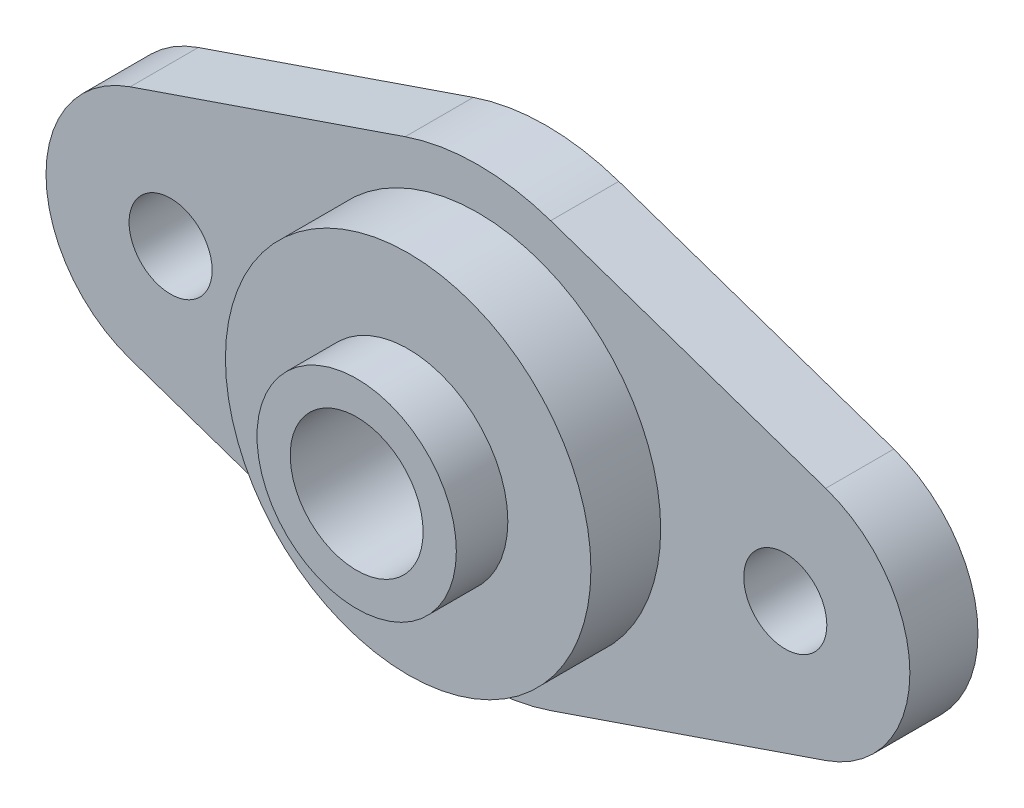
ISO-10303-21;
HEADER;
FILE_DESCRIPTION(('STEP AP214'),'2;1');
FILE_NAME('part.step','',(''),(''),'','','');
FILE_SCHEMA(('AUTOMOTIVE_DESIGN { 1 0 10303 214 1 1 1 1 }'));
ENDSEC;
DATA;
#1=APPLICATION_CONTEXT('core data for automotive mechanical design processes');
#2=APPLICATION_PROTOCOL_DEFINITION('international standard','automotive_design',2000,#1);
#3=PRODUCT_CONTEXT('',#1,'mechanical');
#4=PRODUCT('Part','Part','',(#3));
#5=PRODUCT_RELATED_PRODUCT_CATEGORY('part','',(#4));
#6=PRODUCT_DEFINITION_FORMATION('','',#4);
#7=PRODUCT_DEFINITION_CONTEXT('part definition',#1,'design');
#8=PRODUCT_DEFINITION('design','',#6,#7);
#9=PRODUCT_DEFINITION_SHAPE('','',#8);
#10=(LENGTH_UNIT() NAMED_UNIT(*) SI_UNIT(.MILLI.,.METRE.));
#11=(NAMED_UNIT(*) PLANE_ANGLE_UNIT() SI_UNIT($,.RADIAN.));
#12=(NAMED_UNIT(*) SI_UNIT($,.STERADIAN.) SOLID_ANGLE_UNIT());
#13=UNCERTAINTY_MEASURE_WITH_UNIT(LENGTH_MEASURE(1.E-05),#10,'distance_accuracy_value','');
#14=(GEOMETRIC_REPRESENTATION_CONTEXT(3) GLOBAL_UNCERTAINTY_ASSIGNED_CONTEXT((#13)) GLOBAL_UNIT_ASSIGNED_CONTEXT((#10,
#11,#12)) REPRESENTATION_CONTEXT('',''));
#15=CARTESIAN_POINT('',(0.,0.,0.));
#16=DIRECTION('',(0.,0.,1.));
#17=DIRECTION('',(1.,0.,0.));
#18=AXIS2_PLACEMENT_3D('',#15,#16,#17);
#19=CARTESIAN_POINT('',(0.,0.,4.1));
#20=DIRECTION('',(0.,0.,1.));
#21=DIRECTION('',(1.,0.,0.));
#22=AXIS2_PLACEMENT_3D('',#19,#20,#21);
#23=PLANE('',#22);
#24=CARTESIAN_POINT('',(18.5,0.,4.1));
#25=DIRECTION('',(0.,0.,1.));
#26=DIRECTION('',(1.,0.,0.));
#27=AXIS2_PLACEMENT_3D('',#24,#25,#26);
#28=CIRCLE('',#27,2.5);
#29=CARTESIAN_POINT('',(21.,0.,4.1));
#30=VERTEX_POINT('',#29);
#31=EDGE_CURVE('E196',#30,#30,#28,.T.);
#32=ORIENTED_EDGE('',*,*,#31,.F.);
#33=EDGE_LOOP('',(#32));
#34=FACE_BOUND('',#33,.T.);
#35=CARTESIAN_POINT('',(18.5,0.,4.1));
#36=DIRECTION('',(0.,0.,1.));
#37=DIRECTION('',(1.,0.,0.));
#38=AXIS2_PLACEMENT_3D('',#35,#36,#37);
#39=CIRCLE('',#38,7.5);
#40=CARTESIAN_POINT('',(20.9324324324324,7.0945945945946,4.1));
#41=VERTEX_POINT('',#40);
#42=CARTESIAN_POINT('',(20.9324324324324,-7.0945945945946,4.1));
#43=VERTEX_POINT('',#42);
#44=EDGE_CURVE('E453',#41,#43,#39,.F.);
#45=ORIENTED_EDGE('',*,*,#44,.F.);
#46=DIRECTION('',(-0.945945945945946,0.324324324324324,0.));
#47=VECTOR('',#46,1.);
#48=CARTESIAN_POINT('',(4.37837837837838,12.7702702702703,4.1));
#49=LINE('',#48,#47);
#50=CARTESIAN_POINT('',(4.37837837837838,12.7702702702703,4.1));
#51=VERTEX_POINT('',#50);
#52=EDGE_CURVE('E456',#41,#51,#49,.T.);
#53=ORIENTED_EDGE('',*,*,#52,.T.);
#54=CARTESIAN_POINT('',(0.,0.,4.1));
#55=DIRECTION('',(0.,0.,1.));
#56=DIRECTION('',(1.,0.,0.));
#57=AXIS2_PLACEMENT_3D('',#54,#55,#56);
#58=CIRCLE('',#57,13.5);
#59=CARTESIAN_POINT('',(-4.37837837837838,12.7702702702703,4.1));
#60=VERTEX_POINT('',#59);
#61=EDGE_CURVE('E125',#51,#60,#58,.T.);
#62=ORIENTED_EDGE('',*,*,#61,.T.);
#63=DIRECTION('',(0.945945945945946,0.324324324324324,0.));
#64=VECTOR('',#63,1.);
#65=CARTESIAN_POINT('',(-4.37837837837838,12.7702702702703,4.1));
#66=LINE('',#65,#64);
#67=CARTESIAN_POINT('',(-20.9324324324324,7.0945945945946,4.1));
#68=VERTEX_POINT('',#67);
#69=EDGE_CURVE('E460',#68,#60,#66,.T.);
#70=ORIENTED_EDGE('',*,*,#69,.F.);
#71=CARTESIAN_POINT('',(-18.5,0.,4.1));
#72=DIRECTION('',(0.,0.,1.));
#73=DIRECTION('',(1.,0.,0.));
#74=AXIS2_PLACEMENT_3D('',#71,#72,#73);
#75=CIRCLE('',#74,7.5);
#76=CARTESIAN_POINT('',(-20.9324324324324,-7.0945945945946,4.1));
#77=VERTEX_POINT('',#76);
#78=EDGE_CURVE('E131',#68,#77,#75,.T.);
#79=ORIENTED_EDGE('',*,*,#78,.T.);
#80=DIRECTION('',(0.945945945945946,-0.324324324324324,0.));
#81=VECTOR('',#80,1.);
#82=CARTESIAN_POINT('',(-4.37837837837838,-12.7702702702703,4.1));
#83=LINE('',#82,#81);
#84=CARTESIAN_POINT('',(-4.37837837837838,-12.7702702702703,4.1));
#85=VERTEX_POINT('',#84);
#86=EDGE_CURVE('E123',#77,#85,#83,.T.);
#87=ORIENTED_EDGE('',*,*,#86,.T.);
#88=CARTESIAN_POINT('',(4.37837837837838,-12.7702702702703,4.1));
#89=VERTEX_POINT('',#88);
#90=EDGE_CURVE('E113',#85,#89,#58,.T.);
#91=ORIENTED_EDGE('',*,*,#90,.T.);
#92=DIRECTION('',(-0.945945945945946,-0.324324324324324,0.));
#93=VECTOR('',#92,1.);
#94=CARTESIAN_POINT('',(4.37837837837838,-12.7702702702703,4.1));
#95=LINE('',#94,#93);
#96=EDGE_CURVE('E122',#43,#89,#95,.T.);
#97=ORIENTED_EDGE('',*,*,#96,.F.);
#98=EDGE_LOOP('',(#45,#53,#62,#70,#79,#87,#91,#97));
#99=FACE_BOUND('',#98,.T.);
#100=CARTESIAN_POINT('',(-18.5,0.,4.1));
#101=DIRECTION('',(0.,0.,1.));
#102=DIRECTION('',(1.,0.,0.));
#103=AXIS2_PLACEMENT_3D('',#100,#101,#102);
#104=CIRCLE('',#103,2.5);
#105=CARTESIAN_POINT('',(-16.,0.,4.1));
#106=VERTEX_POINT('',#105);
#107=EDGE_CURVE('E198',#106,#106,#104,.F.);
#108=ORIENTED_EDGE('',*,*,#107,.T.);
#109=EDGE_LOOP('',(#108));
#110=FACE_BOUND('',#109,.T.);
#111=CARTESIAN_POINT('',(0.,0.,4.1));
#112=DIRECTION('',(0.,0.,1.));
#113=DIRECTION('',(1.,0.,0.));
#114=AXIS2_PLACEMENT_3D('',#111,#112,#113);
#115=CIRCLE('',#114,11.);
#116=CARTESIAN_POINT('',(11.,0.,4.1));
#117=VERTEX_POINT('',#116);
#118=EDGE_CURVE('E433',#117,#117,#115,.T.);
#119=ORIENTED_EDGE('',*,*,#118,.F.);
#120=EDGE_LOOP('',(#119));
#121=FACE_BOUND('',#120,.T.);
#122=ADVANCED_FACE('F45',(#34,#99,#110,#121),#23,.T.);
#123=CARTESIAN_POINT('',(18.5,0.,4.1));
#124=DIRECTION('',(0.,0.,-1.));
#125=DIRECTION('',(-1.,0.,0.));
#126=AXIS2_PLACEMENT_3D('',#123,#124,#125);
#127=CYLINDRICAL_SURFACE('',#126,7.5);
#128=CARTESIAN_POINT('',(18.5,0.,0.));
#129=DIRECTION('',(0.,0.,1.));
#130=DIRECTION('',(1.,0.,0.));
#131=AXIS2_PLACEMENT_3D('',#128,#129,#130);
#132=CIRCLE('',#131,7.5);
#133=CARTESIAN_POINT('',(20.9324324324324,7.0945945945946,0.));
#134=VERTEX_POINT('',#133);
#135=CARTESIAN_POINT('',(20.9324324324324,-7.0945945945946,0.));
#136=VERTEX_POINT('',#135);
#137=EDGE_CURVE('E170',#134,#136,#132,.F.);
#138=ORIENTED_EDGE('',*,*,#137,.F.);
#139=DIRECTION('',(0.,0.,-1.));
#140=VECTOR('',#139,1.);
#141=CARTESIAN_POINT('',(20.9324324324324,7.0945945945946,4.1));
#142=LINE('',#141,#140);
#143=EDGE_CURVE('E11',#41,#134,#142,.T.);
#144=ORIENTED_EDGE('',*,*,#143,.F.);
#145=ORIENTED_EDGE('',*,*,#44,.T.);
#146=DIRECTION('',(0.,0.,-1.));
#147=VECTOR('',#146,1.);
#148=CARTESIAN_POINT('',(20.9324324324324,-7.0945945945946,4.1));
#149=LINE('',#148,#147);
#150=EDGE_CURVE('E63',#43,#136,#149,.T.);
#151=ORIENTED_EDGE('',*,*,#150,.T.);
#152=EDGE_LOOP('',(#138,#144,#145,#151));
#153=FACE_BOUND('',#152,.T.);
#154=ADVANCED_FACE('F230',(#153),#127,.T.);
#155=CARTESIAN_POINT('',(4.37837837837838,12.7702702702703,4.1));
#156=DIRECTION('',(-0.324324324324324,-0.945945945945946,0.));
#157=DIRECTION('',(0.945945945945946,-0.324324324324324,0.));
#158=AXIS2_PLACEMENT_3D('',#155,#156,#157);
#159=PLANE('',#158);
#160=DIRECTION('',(-0.945945945945946,0.324324324324324,0.));
#161=VECTOR('',#160,1.);
#162=CARTESIAN_POINT('',(4.37837837837838,12.7702702702703,0.));
#163=LINE('',#162,#161);
#164=CARTESIAN_POINT('',(4.37837837837838,12.7702702702703,0.));
#165=VERTEX_POINT('',#164);
#166=EDGE_CURVE('E166',#134,#165,#163,.T.);
#167=ORIENTED_EDGE('',*,*,#166,.T.);
#168=DIRECTION('',(0.,0.,-1.));
#169=VECTOR('',#168,1.);
#170=CARTESIAN_POINT('',(4.37837837837838,12.7702702702703,4.1));
#171=LINE('',#170,#169);
#172=EDGE_CURVE('E55',#51,#165,#171,.T.);
#173=ORIENTED_EDGE('',*,*,#172,.F.);
#174=ORIENTED_EDGE('',*,*,#52,.F.);
#175=ORIENTED_EDGE('',*,*,#143,.T.);
#176=EDGE_LOOP('',(#167,#173,#174,#175));
#177=FACE_BOUND('',#176,.T.);
#178=ADVANCED_FACE('F167',(#177),#159,.F.);
#179=CARTESIAN_POINT('',(0.,0.,4.1));
#180=DIRECTION('',(0.,0.,-1.));
#181=DIRECTION('',(-1.,0.,0.));
#182=AXIS2_PLACEMENT_3D('',#179,#180,#181);
#183=CYLINDRICAL_SURFACE('',#182,13.5);
#184=CARTESIAN_POINT('',(0.,0.,0.));
#185=DIRECTION('',(0.,0.,1.));
#186=DIRECTION('',(1.,0.,0.));
#187=AXIS2_PLACEMENT_3D('',#184,#185,#186);
#188=CIRCLE('',#187,13.5);
#189=CARTESIAN_POINT('',(-4.37837837837838,12.7702702702703,0.));
#190=VERTEX_POINT('',#189);
#191=EDGE_CURVE('E161',#165,#190,#188,.T.);
#192=ORIENTED_EDGE('',*,*,#191,.T.);
#193=DIRECTION('',(0.,0.,-1.));
#194=VECTOR('',#193,1.);
#195=CARTESIAN_POINT('',(-4.37837837837838,12.7702702702703,4.1));
#196=LINE('',#195,#194);
#197=EDGE_CURVE('E151',#60,#190,#196,.T.);
#198=ORIENTED_EDGE('',*,*,#197,.F.);
#199=ORIENTED_EDGE('',*,*,#61,.F.);
#200=ORIENTED_EDGE('',*,*,#172,.T.);
#201=EDGE_LOOP('',(#192,#198,#199,#200));
#202=FACE_BOUND('',#201,.T.);
#203=ADVANCED_FACE('F159',(#202),#183,.T.);
#204=CARTESIAN_POINT('',(-4.37837837837838,12.7702702702703,4.1));
#205=DIRECTION('',(-0.324324324324324,0.945945945945946,0.));
#206=DIRECTION('',(-0.945945945945946,-0.324324324324324,0.));
#207=AXIS2_PLACEMENT_3D('',#204,#205,#206);
#208=PLANE('',#207);
#209=DIRECTION('',(0.945945945945946,0.324324324324324,0.));
#210=VECTOR('',#209,1.);
#211=CARTESIAN_POINT('',(-4.37837837837838,12.7702702702703,0.));
#212=LINE('',#211,#210);
#213=CARTESIAN_POINT('',(-20.9324324324324,7.0945945945946,0.));
#214=VERTEX_POINT('',#213);
#215=EDGE_CURVE('E174',#214,#190,#212,.T.);
#216=ORIENTED_EDGE('',*,*,#215,.F.);
#217=DIRECTION('',(0.,0.,-1.));
#218=VECTOR('',#217,1.);
#219=CARTESIAN_POINT('',(-20.9324324324324,7.0945945945946,4.1));
#220=LINE('',#219,#218);
#221=EDGE_CURVE('E144',#68,#214,#220,.T.);
#222=ORIENTED_EDGE('',*,*,#221,.F.);
#223=ORIENTED_EDGE('',*,*,#69,.T.);
#224=ORIENTED_EDGE('',*,*,#197,.T.);
#225=EDGE_LOOP('',(#216,#222,#223,#224));
#226=FACE_BOUND('',#225,.T.);
#227=ADVANCED_FACE('F255',(#226),#208,.T.);
#228=CARTESIAN_POINT('',(-18.5,0.,4.1));
#229=DIRECTION('',(0.,0.,-1.));
#230=DIRECTION('',(-1.,0.,0.));
#231=AXIS2_PLACEMENT_3D('',#228,#229,#230);
#232=CYLINDRICAL_SURFACE('',#231,7.5);
#233=CARTESIAN_POINT('',(-18.5,0.,0.));
#234=DIRECTION('',(0.,0.,1.));
#235=DIRECTION('',(1.,0.,0.));
#236=AXIS2_PLACEMENT_3D('',#233,#234,#235);
#237=CIRCLE('',#236,7.5);
#238=CARTESIAN_POINT('',(-20.9324324324324,-7.0945945945946,0.));
#239=VERTEX_POINT('',#238);
#240=EDGE_CURVE('E183',#214,#239,#237,.T.);
#241=ORIENTED_EDGE('',*,*,#240,.T.);
#242=DIRECTION('',(0.,0.,-1.));
#243=VECTOR('',#242,1.);
#244=CARTESIAN_POINT('',(-20.9324324324324,-7.0945945945946,4.1));
#245=LINE('',#244,#243);
#246=EDGE_CURVE('E140',#77,#239,#245,.T.);
#247=ORIENTED_EDGE('',*,*,#246,.F.);
#248=ORIENTED_EDGE('',*,*,#78,.F.);
#249=ORIENTED_EDGE('',*,*,#221,.T.);
#250=EDGE_LOOP('',(#241,#247,#248,#249));
#251=FACE_BOUND('',#250,.T.);
#252=ADVANCED_FACE('F252',(#251),#232,.T.);
#253=CARTESIAN_POINT('',(-4.37837837837838,-12.7702702702703,4.1));
#254=DIRECTION('',(0.324324324324324,0.945945945945946,0.));
#255=DIRECTION('',(-0.945945945945946,0.324324324324324,0.));
#256=AXIS2_PLACEMENT_3D('',#253,#254,#255);
#257=PLANE('',#256);
#258=DIRECTION('',(0.945945945945946,-0.324324324324324,0.));
#259=VECTOR('',#258,1.);
#260=CARTESIAN_POINT('',(-4.37837837837838,-12.7702702702703,0.));
#261=LINE('',#260,#259);
#262=CARTESIAN_POINT('',(-4.37837837837838,-12.7702702702703,0.));
#263=VERTEX_POINT('',#262);
#264=EDGE_CURVE('E138',#239,#263,#261,.T.);
#265=ORIENTED_EDGE('',*,*,#264,.T.);
#266=DIRECTION('',(0.,0.,-1.));
#267=VECTOR('',#266,1.);
#268=CARTESIAN_POINT('',(-4.37837837837838,-12.7702702702703,4.1));
#269=LINE('',#268,#267);
#270=EDGE_CURVE('E117',#85,#263,#269,.T.);
#271=ORIENTED_EDGE('',*,*,#270,.F.);
#272=ORIENTED_EDGE('',*,*,#86,.F.);
#273=ORIENTED_EDGE('',*,*,#246,.T.);
#274=EDGE_LOOP('',(#265,#271,#272,#273));
#275=FACE_BOUND('',#274,.T.);
#276=ADVANCED_FACE('F137',(#275),#257,.F.);
#277=CARTESIAN_POINT('',(4.37837837837838,-12.7702702702703,0.));
#278=VERTEX_POINT('',#277);
#279=EDGE_CURVE('E176',#263,#278,#188,.T.);
#280=ORIENTED_EDGE('',*,*,#279,.T.);
#281=DIRECTION('',(0.,0.,-1.));
#282=VECTOR('',#281,1.);
#283=CARTESIAN_POINT('',(4.37837837837838,-12.7702702702703,4.1));
#284=LINE('',#283,#282);
#285=EDGE_CURVE('E89',#89,#278,#284,.T.);
#286=ORIENTED_EDGE('',*,*,#285,.F.);
#287=ORIENTED_EDGE('',*,*,#90,.F.);
#288=ORIENTED_EDGE('',*,*,#270,.T.);
#289=EDGE_LOOP('',(#280,#286,#287,#288));
#290=FACE_BOUND('',#289,.T.);
#291=ADVANCED_FACE('F115',(#290),#183,.T.);
#292=CARTESIAN_POINT('',(4.37837837837838,-12.7702702702703,4.1));
#293=DIRECTION('',(0.324324324324324,-0.945945945945946,0.));
#294=DIRECTION('',(0.945945945945946,0.324324324324324,0.));
#295=AXIS2_PLACEMENT_3D('',#292,#293,#294);
#296=PLANE('',#295);
#297=DIRECTION('',(-0.945945945945946,-0.324324324324324,0.));
#298=VECTOR('',#297,1.);
#299=CARTESIAN_POINT('',(4.37837837837838,-12.7702702702703,0.));
#300=LINE('',#299,#298);
#301=EDGE_CURVE('E189',#136,#278,#300,.T.);
#302=ORIENTED_EDGE('',*,*,#301,.F.);
#303=ORIENTED_EDGE('',*,*,#150,.F.);
#304=ORIENTED_EDGE('',*,*,#96,.T.);
#305=ORIENTED_EDGE('',*,*,#285,.T.);
#306=EDGE_LOOP('',(#302,#303,#304,#305));
#307=FACE_BOUND('',#306,.T.);
#308=ADVANCED_FACE('F218',(#307),#296,.T.);
#309=CARTESIAN_POINT('',(18.5,0.,4.1));
#310=DIRECTION('',(0.,0.,-1.));
#311=DIRECTION('',(-1.,0.,0.));
#312=AXIS2_PLACEMENT_3D('',#309,#310,#311);
#313=CYLINDRICAL_SURFACE('',#312,2.5);
#314=ORIENTED_EDGE('',*,*,#31,.T.);
#315=EDGE_LOOP('',(#314));
#316=FACE_BOUND('',#315,.T.);
#317=CARTESIAN_POINT('',(18.5,0.,0.));
#318=DIRECTION('',(0.,0.,1.));
#319=DIRECTION('',(1.,0.,0.));
#320=AXIS2_PLACEMENT_3D('',#317,#318,#319);
#321=CIRCLE('',#320,2.5);
#322=CARTESIAN_POINT('',(21.,0.,0.));
#323=VERTEX_POINT('',#322);
#324=EDGE_CURVE('E177',#323,#323,#321,.T.);
#325=ORIENTED_EDGE('',*,*,#324,.F.);
#326=EDGE_LOOP('',(#325));
#327=FACE_BOUND('',#326,.T.);
#328=ADVANCED_FACE('F216',(#316,#327),#313,.F.);
#329=CARTESIAN_POINT('',(0.,0.,4.1));
#330=DIRECTION('',(0.,0.,-1.));
#331=DIRECTION('',(-1.,0.,0.));
#332=AXIS2_PLACEMENT_3D('',#329,#330,#331);
#333=CYLINDRICAL_SURFACE('',#332,4.);
#334=CARTESIAN_POINT('',(0.,0.,0.));
#335=DIRECTION('',(0.,0.,1.));
#336=DIRECTION('',(1.,0.,0.));
#337=AXIS2_PLACEMENT_3D('',#334,#335,#336);
#338=CIRCLE('',#337,4.);
#339=CARTESIAN_POINT('',(4.,0.,0.));
#340=VERTEX_POINT('',#339);
#341=EDGE_CURVE('E206',#340,#340,#338,.T.);
#342=ORIENTED_EDGE('',*,*,#341,.F.);
#343=EDGE_LOOP('',(#342));
#344=FACE_BOUND('',#343,.T.);
#345=CARTESIAN_POINT('',(0.,0.,11.4));
#346=DIRECTION('',(0.,0.,1.));
#347=DIRECTION('',(1.,0.,0.));
#348=AXIS2_PLACEMENT_3D('',#345,#346,#347);
#349=CIRCLE('',#348,4.);
#350=CARTESIAN_POINT('',(4.,0.,11.4));
#351=VERTEX_POINT('',#350);
#352=EDGE_CURVE('E440',#351,#351,#349,.T.);
#353=ORIENTED_EDGE('',*,*,#352,.T.);
#354=EDGE_LOOP('',(#353));
#355=FACE_BOUND('',#354,.T.);
#356=ADVANCED_FACE('F47',(#344,#355),#333,.F.);
#357=CARTESIAN_POINT('',(-18.5,0.,4.1));
#358=DIRECTION('',(0.,0.,-1.));
#359=DIRECTION('',(-1.,0.,0.));
#360=AXIS2_PLACEMENT_3D('',#357,#358,#359);
#361=CYLINDRICAL_SURFACE('',#360,2.5);
#362=ORIENTED_EDGE('',*,*,#107,.F.);
#363=EDGE_LOOP('',(#362));
#364=FACE_BOUND('',#363,.T.);
#365=CARTESIAN_POINT('',(-18.5,0.,0.));
#366=DIRECTION('',(0.,0.,1.));
#367=DIRECTION('',(1.,0.,0.));
#368=AXIS2_PLACEMENT_3D('',#365,#366,#367);
#369=CIRCLE('',#368,2.5);
#370=CARTESIAN_POINT('',(-16.,0.,0.));
#371=VERTEX_POINT('',#370);
#372=EDGE_CURVE('E193',#371,#371,#369,.F.);
#373=ORIENTED_EDGE('',*,*,#372,.T.);
#374=EDGE_LOOP('',(#373));
#375=FACE_BOUND('',#374,.T.);
#376=ADVANCED_FACE('F224',(#364,#375),#361,.F.);
#377=CARTESIAN_POINT('',(0.,0.,0.));
#378=DIRECTION('',(0.,0.,1.));
#379=DIRECTION('',(1.,0.,0.));
#380=AXIS2_PLACEMENT_3D('',#377,#378,#379);
#381=PLANE('',#380);
#382=ORIENTED_EDGE('',*,*,#341,.T.);
#383=EDGE_LOOP('',(#382));
#384=FACE_BOUND('',#383,.T.);
#385=ORIENTED_EDGE('',*,*,#372,.F.);
#386=EDGE_LOOP('',(#385));
#387=FACE_BOUND('',#386,.T.);
#388=ORIENTED_EDGE('',*,*,#137,.T.);
#389=ORIENTED_EDGE('',*,*,#301,.T.);
#390=ORIENTED_EDGE('',*,*,#279,.F.);
#391=ORIENTED_EDGE('',*,*,#264,.F.);
#392=ORIENTED_EDGE('',*,*,#240,.F.);
#393=ORIENTED_EDGE('',*,*,#215,.T.);
#394=ORIENTED_EDGE('',*,*,#191,.F.);
#395=ORIENTED_EDGE('',*,*,#166,.F.);
#396=EDGE_LOOP('',(#388,#389,#390,#391,#392,#393,#394,#395));
#397=FACE_BOUND('',#396,.T.);
#398=ORIENTED_EDGE('',*,*,#324,.T.);
#399=EDGE_LOOP('',(#398));
#400=FACE_BOUND('',#399,.T.);
#401=ADVANCED_FACE('F214',(#384,#387,#397,#400),#381,.F.);
#402=CARTESIAN_POINT('',(0.,0.,11.4));
#403=DIRECTION('',(0.,0.,1.));
#404=DIRECTION('',(1.,0.,0.));
#405=AXIS2_PLACEMENT_3D('',#402,#403,#404);
#406=PLANE('',#405);
#407=CARTESIAN_POINT('',(0.,0.,11.4));
#408=DIRECTION('',(0.,0.,1.));
#409=DIRECTION('',(1.,0.,0.));
#410=AXIS2_PLACEMENT_3D('',#407,#408,#409);
#411=CIRCLE('',#410,6.);
#412=CARTESIAN_POINT('',(6.,0.,11.4));
#413=VERTEX_POINT('',#412);
#414=EDGE_CURVE('E209',#413,#413,#411,.T.);
#415=ORIENTED_EDGE('',*,*,#414,.T.);
#416=EDGE_LOOP('',(#415));
#417=FACE_BOUND('',#416,.T.);
#418=ORIENTED_EDGE('',*,*,#352,.F.);
#419=EDGE_LOOP('',(#418));
#420=FACE_BOUND('',#419,.T.);
#421=ADVANCED_FACE('F243',(#417,#420),#406,.T.);
#422=CARTESIAN_POINT('',(0.,0.,11.4));
#423=DIRECTION('',(0.,0.,-1.));
#424=DIRECTION('',(-1.,0.,0.));
#425=AXIS2_PLACEMENT_3D('',#422,#423,#424);
#426=CYLINDRICAL_SURFACE('',#425,6.);
#427=CARTESIAN_POINT('',(0.,0.,8.3));
#428=DIRECTION('',(0.,0.,1.));
#429=DIRECTION('',(1.,0.,0.));
#430=AXIS2_PLACEMENT_3D('',#427,#428,#429);
#431=CIRCLE('',#430,6.);
#432=CARTESIAN_POINT('',(6.,0.,8.3));
#433=VERTEX_POINT('',#432);
#434=EDGE_CURVE('E436',#433,#433,#431,.T.);
#435=ORIENTED_EDGE('',*,*,#434,.T.);
#436=EDGE_LOOP('',(#435));
#437=FACE_BOUND('',#436,.T.);
#438=ORIENTED_EDGE('',*,*,#414,.F.);
#439=EDGE_LOOP('',(#438));
#440=FACE_BOUND('',#439,.T.);
#441=ADVANCED_FACE('F239',(#437,#440),#426,.T.);
#442=CARTESIAN_POINT('',(0.,0.,8.3));
#443=DIRECTION('',(0.,0.,1.));
#444=DIRECTION('',(1.,0.,0.));
#445=AXIS2_PLACEMENT_3D('',#442,#443,#444);
#446=PLANE('',#445);
#447=CARTESIAN_POINT('',(0.,0.,8.3));
#448=DIRECTION('',(0.,0.,1.));
#449=DIRECTION('',(1.,0.,0.));
#450=AXIS2_PLACEMENT_3D('',#447,#448,#449);
#451=CIRCLE('',#450,11.);
#452=CARTESIAN_POINT('',(11.,0.,8.3));
#453=VERTEX_POINT('',#452);
#454=EDGE_CURVE('E430',#453,#453,#451,.T.);
#455=ORIENTED_EDGE('',*,*,#454,.T.);
#456=EDGE_LOOP('',(#455));
#457=FACE_BOUND('',#456,.T.);
#458=ORIENTED_EDGE('',*,*,#434,.F.);
#459=EDGE_LOOP('',(#458));
#460=FACE_BOUND('',#459,.T.);
#461=ADVANCED_FACE('F338',(#457,#460),#446,.T.);
#462=CARTESIAN_POINT('',(0.,0.,8.3));
#463=DIRECTION('',(0.,0.,-1.));
#464=DIRECTION('',(-1.,0.,0.));
#465=AXIS2_PLACEMENT_3D('',#462,#463,#464);
#466=CYLINDRICAL_SURFACE('',#465,11.);
#467=ORIENTED_EDGE('',*,*,#454,.F.);
#468=EDGE_LOOP('',(#467));
#469=FACE_BOUND('',#468,.T.);
#470=ORIENTED_EDGE('',*,*,#118,.T.);
#471=EDGE_LOOP('',(#470));
#472=FACE_BOUND('',#471,.T.);
#473=ADVANCED_FACE('F348',(#469,#472),#466,.T.);
#474=CLOSED_SHELL('',(#122,#154,#178,#203,#227,#252,#276,#291,#308,#328,#356,#376,#401,#421,
#441,#461,#473));
#475=MANIFOLD_SOLID_BREP('B2',#474);
#476=ADVANCED_BREP_SHAPE_REPRESENTATION('',(#18,#475),#14);
#477=SHAPE_DEFINITION_REPRESENTATION(#9,#476);
ENDSEC;
END-ISO-10303-21;
